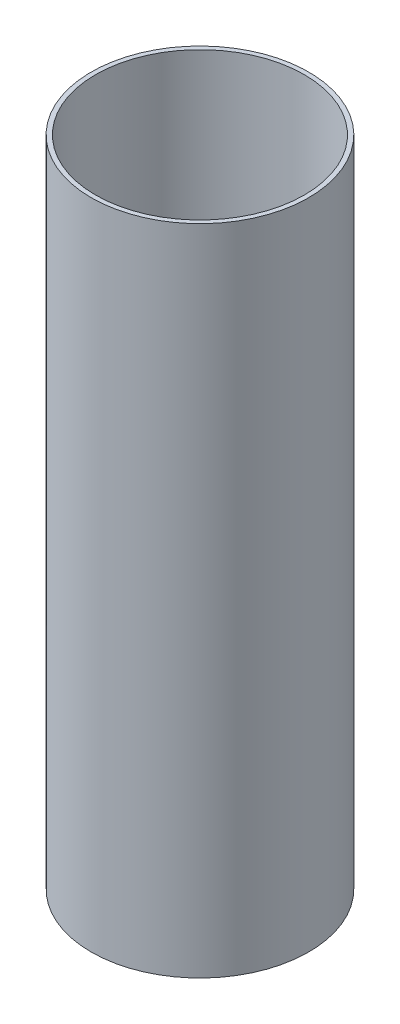
ISO-10303-21;
HEADER;
FILE_DESCRIPTION(('STEP AP214'),'2;1');
FILE_NAME('part.step','',(''),(''),'','','');
FILE_SCHEMA(('AUTOMOTIVE_DESIGN { 1 0 10303 214 1 1 1 1 }'));
ENDSEC;
DATA;
#1=APPLICATION_CONTEXT('core data for automotive mechanical design processes');
#2=APPLICATION_PROTOCOL_DEFINITION('international standard','automotive_design',2000,#1);
#3=PRODUCT_CONTEXT('',#1,'mechanical');
#4=PRODUCT('Part','Part','',(#3));
#5=PRODUCT_RELATED_PRODUCT_CATEGORY('part','',(#4));
#6=PRODUCT_DEFINITION_FORMATION('','',#4);
#7=PRODUCT_DEFINITION_CONTEXT('part definition',#1,'design');
#8=PRODUCT_DEFINITION('design','',#6,#7);
#9=PRODUCT_DEFINITION_SHAPE('','',#8);
#10=(LENGTH_UNIT() NAMED_UNIT(*) SI_UNIT(.MILLI.,.METRE.));
#11=(NAMED_UNIT(*) PLANE_ANGLE_UNIT() SI_UNIT($,.RADIAN.));
#12=(NAMED_UNIT(*) SI_UNIT($,.STERADIAN.) SOLID_ANGLE_UNIT());
#13=UNCERTAINTY_MEASURE_WITH_UNIT(LENGTH_MEASURE(1.E-05),#10,'distance_accuracy_value','');
#14=(GEOMETRIC_REPRESENTATION_CONTEXT(3) GLOBAL_UNCERTAINTY_ASSIGNED_CONTEXT((#13)) GLOBAL_UNIT_ASSIGNED_CONTEXT((#10,
#11,#12)) REPRESENTATION_CONTEXT('',''));
#15=CARTESIAN_POINT('',(0.,0.,0.));
#16=DIRECTION('',(0.,0.,1.));
#17=DIRECTION('',(1.,0.,0.));
#18=AXIS2_PLACEMENT_3D('',#15,#16,#17);
#19=CARTESIAN_POINT('',(0.,228.6,0.));
#20=DIRECTION('',(0.,1.,0.));
#21=DIRECTION('',(0.,0.,1.));
#22=AXIS2_PLACEMENT_3D('',#19,#20,#21);
#23=PLANE('',#22);
#24=CARTESIAN_POINT('',(0.,228.6,0.));
#25=DIRECTION('',(0.,1.,0.));
#26=DIRECTION('',(0.,0.,1.));
#27=AXIS2_PLACEMENT_3D('',#24,#25,#26);
#28=CIRCLE('',#27,38.0746);
#29=CARTESIAN_POINT('',(0.,228.6,38.0746));
#30=VERTEX_POINT('',#29);
#31=EDGE_CURVE('E10',#30,#30,#28,.T.);
#32=ORIENTED_EDGE('',*,*,#31,.T.);
#33=EDGE_LOOP('',(#32));
#34=FACE_BOUND('',#33,.T.);
#35=CARTESIAN_POINT('',(0.,228.6,0.));
#36=DIRECTION('',(0.,1.,0.));
#37=DIRECTION('',(0.,0.,1.));
#38=AXIS2_PLACEMENT_3D('',#35,#36,#37);
#39=CIRCLE('',#38,36.5125);
#40=CARTESIAN_POINT('',(0.,228.6,36.5125));
#41=VERTEX_POINT('',#40);
#42=EDGE_CURVE('E49',#41,#41,#39,.T.);
#43=ORIENTED_EDGE('',*,*,#42,.F.);
#44=EDGE_LOOP('',(#43));
#45=FACE_BOUND('',#44,.T.);
#46=ADVANCED_FACE('F38',(#34,#45),#23,.T.);
#47=CARTESIAN_POINT('',(0.,0.,0.));
#48=DIRECTION('',(0.,1.,0.));
#49=DIRECTION('',(0.,0.,1.));
#50=AXIS2_PLACEMENT_3D('',#47,#48,#49);
#51=PLANE('',#50);
#52=CARTESIAN_POINT('',(0.,0.,0.));
#53=DIRECTION('',(0.,1.,0.));
#54=DIRECTION('',(0.,0.,1.));
#55=AXIS2_PLACEMENT_3D('',#52,#53,#54);
#56=CIRCLE('',#55,38.0746);
#57=CARTESIAN_POINT('',(0.,0.,38.0746));
#58=VERTEX_POINT('',#57);
#59=EDGE_CURVE('E42',#58,#58,#56,.T.);
#60=ORIENTED_EDGE('',*,*,#59,.F.);
#61=EDGE_LOOP('',(#60));
#62=FACE_BOUND('',#61,.T.);
#63=CARTESIAN_POINT('',(0.,0.,0.));
#64=DIRECTION('',(0.,1.,0.));
#65=DIRECTION('',(0.,0.,1.));
#66=AXIS2_PLACEMENT_3D('',#63,#64,#65);
#67=CIRCLE('',#66,36.5125);
#68=CARTESIAN_POINT('',(0.,0.,36.5125));
#69=VERTEX_POINT('',#68);
#70=EDGE_CURVE('E51',#69,#69,#67,.T.);
#71=ORIENTED_EDGE('',*,*,#70,.T.);
#72=EDGE_LOOP('',(#71));
#73=FACE_BOUND('',#72,.T.);
#74=ADVANCED_FACE('F61',(#62,#73),#51,.F.);
#75=CARTESIAN_POINT('',(0.,228.6,0.));
#76=DIRECTION('',(0.,-1.,0.));
#77=DIRECTION('',(0.,0.,-1.));
#78=AXIS2_PLACEMENT_3D('',#75,#76,#77);
#79=CYLINDRICAL_SURFACE('',#78,38.0746);
#80=ORIENTED_EDGE('',*,*,#31,.F.);
#81=EDGE_LOOP('',(#80));
#82=FACE_BOUND('',#81,.T.);
#83=ORIENTED_EDGE('',*,*,#59,.T.);
#84=EDGE_LOOP('',(#83));
#85=FACE_BOUND('',#84,.T.);
#86=ADVANCED_FACE('F40',(#82,#85),#79,.T.);
#87=CARTESIAN_POINT('',(0.,228.6,0.));
#88=DIRECTION('',(0.,-1.,0.));
#89=DIRECTION('',(0.,0.,-1.));
#90=AXIS2_PLACEMENT_3D('',#87,#88,#89);
#91=CYLINDRICAL_SURFACE('',#90,36.5125);
#92=ORIENTED_EDGE('',*,*,#42,.T.);
#93=EDGE_LOOP('',(#92));
#94=FACE_BOUND('',#93,.T.);
#95=ORIENTED_EDGE('',*,*,#70,.F.);
#96=EDGE_LOOP('',(#95));
#97=FACE_BOUND('',#96,.T.);
#98=ADVANCED_FACE('F57',(#94,#97),#91,.F.);
#99=CLOSED_SHELL('',(#46,#74,#86,#98));
#100=MANIFOLD_SOLID_BREP('B2',#99);
#101=ADVANCED_BREP_SHAPE_REPRESENTATION('',(#18,#100),#14);
#102=SHAPE_DEFINITION_REPRESENTATION(#9,#101);
ENDSEC;
END-ISO-10303-21;
